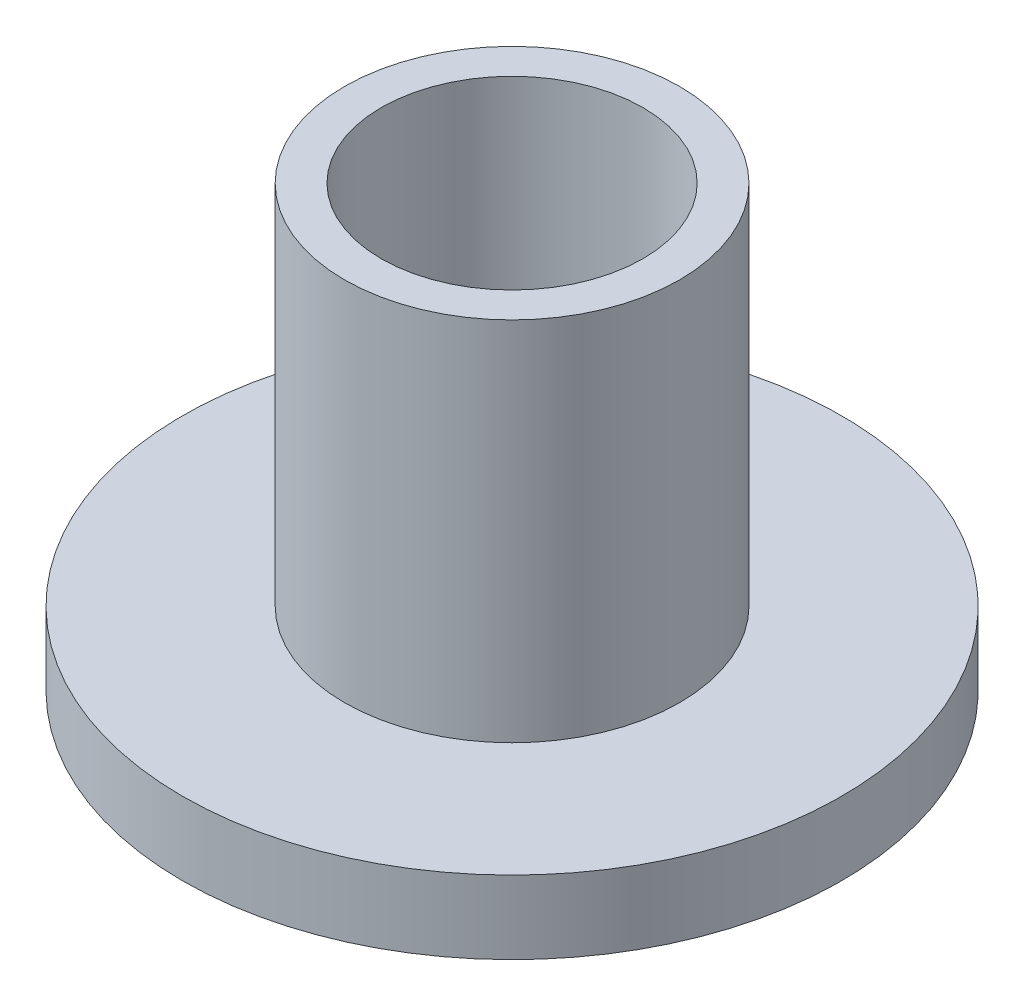
ISO-10303-21;
HEADER;
FILE_DESCRIPTION(('STEP AP214'),'2;1');
FILE_NAME('part.step','',(''),(''),'','','');
FILE_SCHEMA(('AUTOMOTIVE_DESIGN { 1 0 10303 214 1 1 1 1 }'));
ENDSEC;
DATA;
#1=APPLICATION_CONTEXT('core data for automotive mechanical design processes');
#2=APPLICATION_PROTOCOL_DEFINITION('international standard','automotive_design',2000,#1);
#3=PRODUCT_CONTEXT('',#1,'mechanical');
#4=PRODUCT('Part','Part','',(#3));
#5=PRODUCT_RELATED_PRODUCT_CATEGORY('part','',(#4));
#6=PRODUCT_DEFINITION_FORMATION('','',#4);
#7=PRODUCT_DEFINITION_CONTEXT('part definition',#1,'design');
#8=PRODUCT_DEFINITION('design','',#6,#7);
#9=PRODUCT_DEFINITION_SHAPE('','',#8);
#10=(LENGTH_UNIT() NAMED_UNIT(*) SI_UNIT(.MILLI.,.METRE.));
#11=(NAMED_UNIT(*) PLANE_ANGLE_UNIT() SI_UNIT($,.RADIAN.));
#12=(NAMED_UNIT(*) SI_UNIT($,.STERADIAN.) SOLID_ANGLE_UNIT());
#13=UNCERTAINTY_MEASURE_WITH_UNIT(LENGTH_MEASURE(1.E-05),#10,'distance_accuracy_value','');
#14=(GEOMETRIC_REPRESENTATION_CONTEXT(3) GLOBAL_UNCERTAINTY_ASSIGNED_CONTEXT((#13)) GLOBAL_UNIT_ASSIGNED_CONTEXT((#10,
#11,#12)) REPRESENTATION_CONTEXT('',''));
#15=CARTESIAN_POINT('',(0.,0.,0.));
#16=DIRECTION('',(0.,0.,1.));
#17=DIRECTION('',(1.,0.,0.));
#18=AXIS2_PLACEMENT_3D('',#15,#16,#17);
#19=CARTESIAN_POINT('',(0.,2.,0.));
#20=DIRECTION('',(0.,1.,0.));
#21=DIRECTION('',(0.,0.,1.));
#22=AXIS2_PLACEMENT_3D('',#19,#20,#21);
#23=PLANE('',#22);
#24=CARTESIAN_POINT('',(0.,2.,0.));
#25=DIRECTION('',(0.,1.,0.));
#26=DIRECTION('',(0.,0.,1.));
#27=AXIS2_PLACEMENT_3D('',#24,#25,#26);
#28=CIRCLE('',#27,4.575);
#29=CARTESIAN_POINT('',(0.,2.,4.575));
#30=VERTEX_POINT('',#29);
#31=EDGE_CURVE('E54',#30,#30,#28,.T.);
#32=ORIENTED_EDGE('',*,*,#31,.F.);
#33=EDGE_LOOP('',(#32));
#34=FACE_BOUND('',#33,.T.);
#35=CARTESIAN_POINT('',(0.,2.,0.));
#36=DIRECTION('',(0.,1.,0.));
#37=DIRECTION('',(0.,0.,1.));
#38=AXIS2_PLACEMENT_3D('',#35,#36,#37);
#39=CIRCLE('',#38,9.);
#40=CARTESIAN_POINT('',(0.,2.,9.));
#41=VERTEX_POINT('',#40);
#42=EDGE_CURVE('E10',#41,#41,#39,.T.);
#43=ORIENTED_EDGE('',*,*,#42,.T.);
#44=EDGE_LOOP('',(#43));
#45=FACE_BOUND('',#44,.T.);
#46=ADVANCED_FACE('F38',(#34,#45),#23,.T.);
#47=CARTESIAN_POINT('',(0.,0.,0.));
#48=DIRECTION('',(0.,1.,0.));
#49=DIRECTION('',(0.,0.,1.));
#50=AXIS2_PLACEMENT_3D('',#47,#48,#49);
#51=PLANE('',#50);
#52=CARTESIAN_POINT('',(0.,0.,0.));
#53=DIRECTION('',(0.,1.,0.));
#54=DIRECTION('',(0.,0.,1.));
#55=AXIS2_PLACEMENT_3D('',#52,#53,#54);
#56=CIRCLE('',#55,9.);
#57=CARTESIAN_POINT('',(0.,0.,9.));
#58=VERTEX_POINT('',#57);
#59=EDGE_CURVE('E42',#58,#58,#56,.T.);
#60=ORIENTED_EDGE('',*,*,#59,.F.);
#61=EDGE_LOOP('',(#60));
#62=FACE_BOUND('',#61,.T.);
#63=CARTESIAN_POINT('',(0.,0.,0.));
#64=DIRECTION('',(0.,1.,0.));
#65=DIRECTION('',(0.,0.,1.));
#66=AXIS2_PLACEMENT_3D('',#63,#64,#65);
#67=CIRCLE('',#66,3.575);
#68=CARTESIAN_POINT('',(0.,0.,3.575));
#69=VERTEX_POINT('',#68);
#70=EDGE_CURVE('E49',#69,#69,#67,.T.);
#71=ORIENTED_EDGE('',*,*,#70,.T.);
#72=EDGE_LOOP('',(#71));
#73=FACE_BOUND('',#72,.T.);
#74=ADVANCED_FACE('F77',(#62,#73),#51,.F.);
#75=CARTESIAN_POINT('',(0.,2.,0.));
#76=DIRECTION('',(0.,-1.,0.));
#77=DIRECTION('',(0.,0.,-1.));
#78=AXIS2_PLACEMENT_3D('',#75,#76,#77);
#79=CYLINDRICAL_SURFACE('',#78,9.);
#80=ORIENTED_EDGE('',*,*,#42,.F.);
#81=EDGE_LOOP('',(#80));
#82=FACE_BOUND('',#81,.T.);
#83=ORIENTED_EDGE('',*,*,#59,.T.);
#84=EDGE_LOOP('',(#83));
#85=FACE_BOUND('',#84,.T.);
#86=ADVANCED_FACE('F40',(#82,#85),#79,.T.);
#87=CARTESIAN_POINT('',(0.,2.,0.));
#88=DIRECTION('',(0.,-1.,0.));
#89=DIRECTION('',(0.,0.,-1.));
#90=AXIS2_PLACEMENT_3D('',#87,#88,#89);
#91=CYLINDRICAL_SURFACE('',#90,3.575);
#92=ORIENTED_EDGE('',*,*,#70,.F.);
#93=EDGE_LOOP('',(#92));
#94=FACE_BOUND('',#93,.T.);
#95=CARTESIAN_POINT('',(0.,12.,0.));
#96=DIRECTION('',(0.,1.,0.));
#97=DIRECTION('',(0.,0.,1.));
#98=AXIS2_PLACEMENT_3D('',#95,#96,#97);
#99=CIRCLE('',#98,3.575);
#100=CARTESIAN_POINT('',(0.,12.,3.575));
#101=VERTEX_POINT('',#100);
#102=EDGE_CURVE('E57',#101,#101,#99,.F.);
#103=ORIENTED_EDGE('',*,*,#102,.F.);
#104=EDGE_LOOP('',(#103));
#105=FACE_BOUND('',#104,.T.);
#106=ADVANCED_FACE('F66',(#94,#105),#91,.F.);
#107=CARTESIAN_POINT('',(0.,12.,0.));
#108=DIRECTION('',(0.,-1.,0.));
#109=DIRECTION('',(0.,0.,-1.));
#110=AXIS2_PLACEMENT_3D('',#107,#108,#109);
#111=CYLINDRICAL_SURFACE('',#110,4.575);
#112=CARTESIAN_POINT('',(0.,12.,0.));
#113=DIRECTION('',(0.,1.,0.));
#114=DIRECTION('',(0.,0.,1.));
#115=AXIS2_PLACEMENT_3D('',#112,#113,#114);
#116=CIRCLE('',#115,4.575);
#117=CARTESIAN_POINT('',(0.,12.,4.575));
#118=VERTEX_POINT('',#117);
#119=EDGE_CURVE('E53',#118,#118,#116,.T.);
#120=ORIENTED_EDGE('',*,*,#119,.F.);
#121=EDGE_LOOP('',(#120));
#122=FACE_BOUND('',#121,.T.);
#123=ORIENTED_EDGE('',*,*,#31,.T.);
#124=EDGE_LOOP('',(#123));
#125=FACE_BOUND('',#124,.T.);
#126=ADVANCED_FACE('F68',(#122,#125),#111,.T.);
#127=CARTESIAN_POINT('',(0.,12.,0.));
#128=DIRECTION('',(0.,1.,0.));
#129=DIRECTION('',(0.,0.,1.));
#130=AXIS2_PLACEMENT_3D('',#127,#128,#129);
#131=PLANE('',#130);
#132=ORIENTED_EDGE('',*,*,#102,.T.);
#133=EDGE_LOOP('',(#132));
#134=FACE_BOUND('',#133,.T.);
#135=ORIENTED_EDGE('',*,*,#119,.T.);
#136=EDGE_LOOP('',(#135));
#137=FACE_BOUND('',#136,.T.);
#138=ADVANCED_FACE('F63',(#134,#137),#131,.T.);
#139=CLOSED_SHELL('',(#46,#74,#86,#106,#126,#138));
#140=MANIFOLD_SOLID_BREP('B2',#139);
#141=ADVANCED_BREP_SHAPE_REPRESENTATION('',(#18,#140),#14);
#142=SHAPE_DEFINITION_REPRESENTATION(#9,#141);
ENDSEC;
END-ISO-10303-21;
